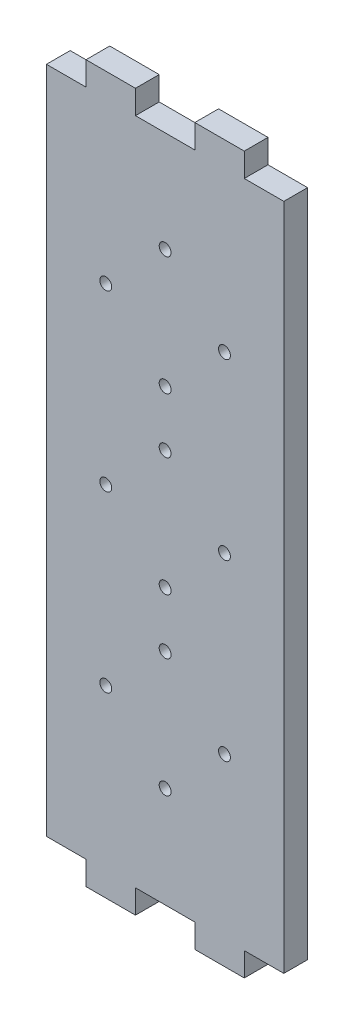
ISO-10303-21;
HEADER;
FILE_DESCRIPTION(('STEP AP214'),'2;1');
FILE_NAME('part.step','',(''),(''),'','','');
FILE_SCHEMA(('AUTOMOTIVE_DESIGN { 1 0 10303 214 1 1 1 1 }'));
ENDSEC;
DATA;
#1=APPLICATION_CONTEXT('core data for automotive mechanical design processes');
#2=APPLICATION_PROTOCOL_DEFINITION('international standard','automotive_design',2000,#1);
#3=PRODUCT_CONTEXT('',#1,'mechanical');
#4=PRODUCT('Part','Part','',(#3));
#5=PRODUCT_RELATED_PRODUCT_CATEGORY('part','',(#4));
#6=PRODUCT_DEFINITION_FORMATION('','',#4);
#7=PRODUCT_DEFINITION_CONTEXT('part definition',#1,'design');
#8=PRODUCT_DEFINITION('design','',#6,#7);
#9=PRODUCT_DEFINITION_SHAPE('','',#8);
#10=(LENGTH_UNIT() NAMED_UNIT(*) SI_UNIT(.MILLI.,.METRE.));
#11=(NAMED_UNIT(*) PLANE_ANGLE_UNIT() SI_UNIT($,.RADIAN.));
#12=(NAMED_UNIT(*) SI_UNIT($,.STERADIAN.) SOLID_ANGLE_UNIT());
#13=UNCERTAINTY_MEASURE_WITH_UNIT(LENGTH_MEASURE(1.E-05),#10,'distance_accuracy_value','');
#14=(GEOMETRIC_REPRESENTATION_CONTEXT(3) GLOBAL_UNCERTAINTY_ASSIGNED_CONTEXT((#13)) GLOBAL_UNIT_ASSIGNED_CONTEXT((#10,
#11,#12)) REPRESENTATION_CONTEXT('',''));
#15=CARTESIAN_POINT('',(0.,0.,0.));
#16=DIRECTION('',(0.,0.,1.));
#17=DIRECTION('',(1.,0.,0.));
#18=AXIS2_PLACEMENT_3D('',#15,#16,#17);
#19=CARTESIAN_POINT('',(0.,0.,3.));
#20=DIRECTION('',(0.,0.,1.));
#21=DIRECTION('',(1.,0.,0.));
#22=AXIS2_PLACEMENT_3D('',#19,#20,#21);
#23=PLANE('',#22);
#24=CARTESIAN_POINT('',(0.,-29.5,3.));
#25=DIRECTION('',(0.,0.,1.));
#26=DIRECTION('',(1.,0.,0.));
#27=AXIS2_PLACEMENT_3D('',#24,#25,#26);
#28=CIRCLE('',#27,0.75);
#29=CARTESIAN_POINT('',(0.75,-29.5,3.));
#30=VERTEX_POINT('',#29);
#31=EDGE_CURVE('E426',#30,#30,#28,.T.);
#32=ORIENTED_EDGE('',*,*,#31,.F.);
#33=EDGE_LOOP('',(#32));
#34=FACE_BOUND('',#33,.T.);
#35=CARTESIAN_POINT('',(0.,-14.5,3.));
#36=DIRECTION('',(0.,0.,1.));
#37=DIRECTION('',(1.,0.,0.));
#38=AXIS2_PLACEMENT_3D('',#35,#36,#37);
#39=CIRCLE('',#38,0.75);
#40=CARTESIAN_POINT('',(0.75,-14.5,3.));
#41=VERTEX_POINT('',#40);
#42=EDGE_CURVE('E438',#41,#41,#39,.T.);
#43=ORIENTED_EDGE('',*,*,#42,.F.);
#44=EDGE_LOOP('',(#43));
#45=FACE_BOUND('',#44,.T.);
#46=CARTESIAN_POINT('',(0.,-7.5,3.));
#47=DIRECTION('',(0.,0.,1.));
#48=DIRECTION('',(1.,0.,0.));
#49=AXIS2_PLACEMENT_3D('',#46,#47,#48);
#50=CIRCLE('',#49,0.75);
#51=CARTESIAN_POINT('',(0.75,-7.5,3.));
#52=VERTEX_POINT('',#51);
#53=EDGE_CURVE('E450',#52,#52,#50,.T.);
#54=ORIENTED_EDGE('',*,*,#53,.F.);
#55=EDGE_LOOP('',(#54));
#56=FACE_BOUND('',#55,.T.);
#57=CARTESIAN_POINT('',(0.,7.5,3.));
#58=DIRECTION('',(0.,0.,1.));
#59=DIRECTION('',(1.,0.,0.));
#60=AXIS2_PLACEMENT_3D('',#57,#58,#59);
#61=CIRCLE('',#60,0.75);
#62=CARTESIAN_POINT('',(0.75,7.5,3.));
#63=VERTEX_POINT('',#62);
#64=EDGE_CURVE('E462',#63,#63,#61,.T.);
#65=ORIENTED_EDGE('',*,*,#64,.F.);
#66=EDGE_LOOP('',(#65));
#67=FACE_BOUND('',#66,.T.);
#68=CARTESIAN_POINT('',(0.,14.5,3.));
#69=DIRECTION('',(0.,0.,1.));
#70=DIRECTION('',(1.,0.,0.));
#71=AXIS2_PLACEMENT_3D('',#68,#69,#70);
#72=CIRCLE('',#71,0.75);
#73=CARTESIAN_POINT('',(0.749999999999998,14.5,3.));
#74=VERTEX_POINT('',#73);
#75=EDGE_CURVE('E474',#74,#74,#72,.T.);
#76=ORIENTED_EDGE('',*,*,#75,.F.);
#77=EDGE_LOOP('',(#76));
#78=FACE_BOUND('',#77,.T.);
#79=CARTESIAN_POINT('',(0.,29.5,3.));
#80=DIRECTION('',(0.,0.,1.));
#81=DIRECTION('',(1.,0.,0.));
#82=AXIS2_PLACEMENT_3D('',#79,#80,#81);
#83=CIRCLE('',#82,0.75);
#84=CARTESIAN_POINT('',(0.749999999999998,29.5,3.));
#85=VERTEX_POINT('',#84);
#86=EDGE_CURVE('E205',#85,#85,#83,.T.);
#87=ORIENTED_EDGE('',*,*,#86,.F.);
#88=EDGE_LOOP('',(#87));
#89=FACE_BOUND('',#88,.T.);
#90=DIRECTION('',(0.,-1.,0.));
#91=VECTOR('',#90,1.);
#92=CARTESIAN_POINT('',(-15.,42.25,3.));
#93=LINE('',#92,#91);
#94=CARTESIAN_POINT('',(-15.,42.25,3.));
#95=VERTEX_POINT('',#94);
#96=CARTESIAN_POINT('',(-15.,-42.25,3.));
#97=VERTEX_POINT('',#96);
#98=EDGE_CURVE('E240',#95,#97,#93,.T.);
#99=ORIENTED_EDGE('',*,*,#98,.T.);
#100=DIRECTION('',(1.,0.,0.));
#101=VECTOR('',#100,1.);
#102=CARTESIAN_POINT('',(-15.,-42.25,3.));
#103=LINE('',#102,#101);
#104=CARTESIAN_POINT('',(-9.99999999999999,-42.25,3.));
#105=VERTEX_POINT('',#104);
#106=EDGE_CURVE('E128',#97,#105,#103,.T.);
#107=ORIENTED_EDGE('',*,*,#106,.T.);
#108=DIRECTION('',(0.,-1.,0.));
#109=VECTOR('',#108,1.);
#110=CARTESIAN_POINT('',(-9.99999999999999,-42.25,3.));
#111=LINE('',#110,#109);
#112=CARTESIAN_POINT('',(-9.99999999999999,-45.25,3.));
#113=VERTEX_POINT('',#112);
#114=EDGE_CURVE('E291',#105,#113,#111,.T.);
#115=ORIENTED_EDGE('',*,*,#114,.T.);
#116=DIRECTION('',(1.,0.,0.));
#117=VECTOR('',#116,1.);
#118=CARTESIAN_POINT('',(-9.99999999999999,-45.25,3.));
#119=LINE('',#118,#117);
#120=CARTESIAN_POINT('',(-3.75,-45.25,3.));
#121=VERTEX_POINT('',#120);
#122=EDGE_CURVE('E310',#113,#121,#119,.T.);
#123=ORIENTED_EDGE('',*,*,#122,.T.);
#124=DIRECTION('',(0.,1.,0.));
#125=VECTOR('',#124,1.);
#126=CARTESIAN_POINT('',(-3.75,-45.25,3.));
#127=LINE('',#126,#125);
#128=CARTESIAN_POINT('',(-3.74999999999999,-42.25,3.));
#129=VERTEX_POINT('',#128);
#130=EDGE_CURVE('E307',#121,#129,#127,.T.);
#131=ORIENTED_EDGE('',*,*,#130,.T.);
#132=DIRECTION('',(1.,0.,0.));
#133=VECTOR('',#132,1.);
#134=CARTESIAN_POINT('',(-3.74999999999999,-42.25,3.));
#135=LINE('',#134,#133);
#136=CARTESIAN_POINT('',(3.75,-42.25,3.));
#137=VERTEX_POINT('',#136);
#138=EDGE_CURVE('E309',#129,#137,#135,.T.);
#139=ORIENTED_EDGE('',*,*,#138,.T.);
#140=DIRECTION('',(0.,-1.,0.));
#141=VECTOR('',#140,1.);
#142=CARTESIAN_POINT('',(3.75,-42.25,3.));
#143=LINE('',#142,#141);
#144=CARTESIAN_POINT('',(3.75,-45.25,3.));
#145=VERTEX_POINT('',#144);
#146=EDGE_CURVE('E312',#137,#145,#143,.T.);
#147=ORIENTED_EDGE('',*,*,#146,.T.);
#148=DIRECTION('',(1.,0.,0.));
#149=VECTOR('',#148,1.);
#150=CARTESIAN_POINT('',(3.75,-45.25,3.));
#151=LINE('',#150,#149);
#152=CARTESIAN_POINT('',(9.99999999999999,-45.25,3.));
#153=VERTEX_POINT('',#152);
#154=EDGE_CURVE('E318',#145,#153,#151,.T.);
#155=ORIENTED_EDGE('',*,*,#154,.T.);
#156=DIRECTION('',(0.,1.,0.));
#157=VECTOR('',#156,1.);
#158=CARTESIAN_POINT('',(9.99999999999999,-45.25,3.));
#159=LINE('',#158,#157);
#160=CARTESIAN_POINT('',(9.99999999999999,-42.25,3.));
#161=VERTEX_POINT('',#160);
#162=EDGE_CURVE('E320',#153,#161,#159,.T.);
#163=ORIENTED_EDGE('',*,*,#162,.T.);
#164=DIRECTION('',(1.,0.,0.));
#165=VECTOR('',#164,1.);
#166=CARTESIAN_POINT('',(9.99999999999999,-42.25,3.));
#167=LINE('',#166,#165);
#168=CARTESIAN_POINT('',(15.,-42.25,3.));
#169=VERTEX_POINT('',#168);
#170=EDGE_CURVE('E322',#161,#169,#167,.T.);
#171=ORIENTED_EDGE('',*,*,#170,.T.);
#172=DIRECTION('',(0.,1.,0.));
#173=VECTOR('',#172,1.);
#174=CARTESIAN_POINT('',(15.,42.25,3.));
#175=LINE('',#174,#173);
#176=CARTESIAN_POINT('',(15.,42.25,3.));
#177=VERTEX_POINT('',#176);
#178=EDGE_CURVE('E324',#169,#177,#175,.T.);
#179=ORIENTED_EDGE('',*,*,#178,.T.);
#180=DIRECTION('',(-1.,0.,0.));
#181=VECTOR('',#180,1.);
#182=CARTESIAN_POINT('',(9.99999999999999,42.25,3.));
#183=LINE('',#182,#181);
#184=CARTESIAN_POINT('',(9.99999999999999,42.25,3.));
#185=VERTEX_POINT('',#184);
#186=EDGE_CURVE('E326',#177,#185,#183,.T.);
#187=ORIENTED_EDGE('',*,*,#186,.T.);
#188=DIRECTION('',(0.,1.,0.));
#189=VECTOR('',#188,1.);
#190=CARTESIAN_POINT('',(9.99999999999999,45.25,3.));
#191=LINE('',#190,#189);
#192=CARTESIAN_POINT('',(9.99999999999999,45.25,3.));
#193=VERTEX_POINT('',#192);
#194=EDGE_CURVE('E328',#185,#193,#191,.T.);
#195=ORIENTED_EDGE('',*,*,#194,.T.);
#196=DIRECTION('',(-1.,0.,0.));
#197=VECTOR('',#196,1.);
#198=CARTESIAN_POINT('',(3.75,45.25,3.));
#199=LINE('',#198,#197);
#200=CARTESIAN_POINT('',(3.75,45.25,3.));
#201=VERTEX_POINT('',#200);
#202=EDGE_CURVE('E330',#193,#201,#199,.T.);
#203=ORIENTED_EDGE('',*,*,#202,.T.);
#204=DIRECTION('',(0.,-1.,0.));
#205=VECTOR('',#204,1.);
#206=CARTESIAN_POINT('',(3.75,42.25,3.));
#207=LINE('',#206,#205);
#208=CARTESIAN_POINT('',(3.75,42.25,3.));
#209=VERTEX_POINT('',#208);
#210=EDGE_CURVE('E332',#201,#209,#207,.T.);
#211=ORIENTED_EDGE('',*,*,#210,.T.);
#212=DIRECTION('',(-1.,0.,0.));
#213=VECTOR('',#212,1.);
#214=CARTESIAN_POINT('',(-3.75,42.25,3.));
#215=LINE('',#214,#213);
#216=CARTESIAN_POINT('',(-3.75,42.25,3.));
#217=VERTEX_POINT('',#216);
#218=EDGE_CURVE('E334',#209,#217,#215,.T.);
#219=ORIENTED_EDGE('',*,*,#218,.T.);
#220=DIRECTION('',(0.,1.,0.));
#221=VECTOR('',#220,1.);
#222=CARTESIAN_POINT('',(-3.75,45.25,3.));
#223=LINE('',#222,#221);
#224=CARTESIAN_POINT('',(-3.75,45.25,3.));
#225=VERTEX_POINT('',#224);
#226=EDGE_CURVE('E183',#217,#225,#223,.T.);
#227=ORIENTED_EDGE('',*,*,#226,.T.);
#228=DIRECTION('',(-1.,0.,0.));
#229=VECTOR('',#228,1.);
#230=CARTESIAN_POINT('',(-10.,45.25,3.));
#231=LINE('',#230,#229);
#232=CARTESIAN_POINT('',(-10.,45.25,3.));
#233=VERTEX_POINT('',#232);
#234=EDGE_CURVE('E177',#225,#233,#231,.T.);
#235=ORIENTED_EDGE('',*,*,#234,.T.);
#236=DIRECTION('',(0.,-1.,0.));
#237=VECTOR('',#236,1.);
#238=CARTESIAN_POINT('',(-10.,42.25,3.));
#239=LINE('',#238,#237);
#240=CARTESIAN_POINT('',(-10.,42.25,3.));
#241=VERTEX_POINT('',#240);
#242=EDGE_CURVE('E181',#233,#241,#239,.T.);
#243=ORIENTED_EDGE('',*,*,#242,.T.);
#244=DIRECTION('',(-1.,0.,0.));
#245=VECTOR('',#244,1.);
#246=CARTESIAN_POINT('',(-15.,42.25,3.));
#247=LINE('',#246,#245);
#248=EDGE_CURVE('E49',#241,#95,#247,.T.);
#249=ORIENTED_EDGE('',*,*,#248,.T.);
#250=EDGE_LOOP('',(#99,#107,#115,#123,#131,#139,#147,#155,#163,#171,#179,#187,#195,#203,#211,
#219,#227,#235,#243,#249));
#251=FACE_BOUND('',#250,.T.);
#252=CARTESIAN_POINT('',(7.5,22.,3.));
#253=DIRECTION('',(0.,0.,1.));
#254=DIRECTION('',(1.,0.,0.));
#255=AXIS2_PLACEMENT_3D('',#252,#253,#254);
#256=CIRCLE('',#255,0.75);
#257=CARTESIAN_POINT('',(8.25,22.,3.));
#258=VERTEX_POINT('',#257);
#259=EDGE_CURVE('E480',#258,#258,#256,.T.);
#260=ORIENTED_EDGE('',*,*,#259,.F.);
#261=EDGE_LOOP('',(#260));
#262=FACE_BOUND('',#261,.T.);
#263=CARTESIAN_POINT('',(-7.5,22.,3.));
#264=DIRECTION('',(0.,0.,1.));
#265=DIRECTION('',(1.,0.,0.));
#266=AXIS2_PLACEMENT_3D('',#263,#264,#265);
#267=CIRCLE('',#266,0.75);
#268=CARTESIAN_POINT('',(-6.75,22.,3.));
#269=VERTEX_POINT('',#268);
#270=EDGE_CURVE('E468',#269,#269,#267,.T.);
#271=ORIENTED_EDGE('',*,*,#270,.F.);
#272=EDGE_LOOP('',(#271));
#273=FACE_BOUND('',#272,.T.);
#274=CARTESIAN_POINT('',(-7.5,0.,3.));
#275=DIRECTION('',(0.,0.,1.));
#276=DIRECTION('',(1.,0.,0.));
#277=AXIS2_PLACEMENT_3D('',#274,#275,#276);
#278=CIRCLE('',#277,0.75);
#279=CARTESIAN_POINT('',(-6.75,0.,3.));
#280=VERTEX_POINT('',#279);
#281=EDGE_CURVE('E456',#280,#280,#278,.T.);
#282=ORIENTED_EDGE('',*,*,#281,.F.);
#283=EDGE_LOOP('',(#282));
#284=FACE_BOUND('',#283,.T.);
#285=CARTESIAN_POINT('',(7.5,0.,3.));
#286=DIRECTION('',(0.,0.,1.));
#287=DIRECTION('',(1.,0.,0.));
#288=AXIS2_PLACEMENT_3D('',#285,#286,#287);
#289=CIRCLE('',#288,0.75);
#290=CARTESIAN_POINT('',(8.25,0.,3.));
#291=VERTEX_POINT('',#290);
#292=EDGE_CURVE('E444',#291,#291,#289,.T.);
#293=ORIENTED_EDGE('',*,*,#292,.F.);
#294=EDGE_LOOP('',(#293));
#295=FACE_BOUND('',#294,.T.);
#296=CARTESIAN_POINT('',(-7.5,-22.,3.));
#297=DIRECTION('',(0.,0.,1.));
#298=DIRECTION('',(1.,0.,0.));
#299=AXIS2_PLACEMENT_3D('',#296,#297,#298);
#300=CIRCLE('',#299,0.75);
#301=CARTESIAN_POINT('',(-6.75,-22.,3.));
#302=VERTEX_POINT('',#301);
#303=EDGE_CURVE('E432',#302,#302,#300,.T.);
#304=ORIENTED_EDGE('',*,*,#303,.F.);
#305=EDGE_LOOP('',(#304));
#306=FACE_BOUND('',#305,.T.);
#307=CARTESIAN_POINT('',(7.5,-22.,3.));
#308=DIRECTION('',(0.,0.,1.));
#309=DIRECTION('',(1.,0.,0.));
#310=AXIS2_PLACEMENT_3D('',#307,#308,#309);
#311=CIRCLE('',#310,0.75);
#312=CARTESIAN_POINT('',(8.25,-22.,3.));
#313=VERTEX_POINT('',#312);
#314=EDGE_CURVE('E417',#313,#313,#311,.T.);
#315=ORIENTED_EDGE('',*,*,#314,.F.);
#316=EDGE_LOOP('',(#315));
#317=FACE_BOUND('',#316,.T.);
#318=ADVANCED_FACE('F32',(#34,#45,#56,#67,#78,#89,#251,#262,#273,#284,#295,#306,#317),#23,.T.);
#319=CARTESIAN_POINT('',(0.,0.,0.));
#320=DIRECTION('',(0.,0.,1.));
#321=DIRECTION('',(1.,0.,0.));
#322=AXIS2_PLACEMENT_3D('',#319,#320,#321);
#323=PLANE('',#322);
#324=DIRECTION('',(0.,-1.,0.));
#325=VECTOR('',#324,1.);
#326=CARTESIAN_POINT('',(-15.,42.25,0.));
#327=LINE('',#326,#325);
#328=CARTESIAN_POINT('',(-15.,42.25,0.));
#329=VERTEX_POINT('',#328);
#330=CARTESIAN_POINT('',(-15.,-42.25,0.));
#331=VERTEX_POINT('',#330);
#332=EDGE_CURVE('E201',#329,#331,#327,.T.);
#333=ORIENTED_EDGE('',*,*,#332,.F.);
#334=DIRECTION('',(-1.,0.,0.));
#335=VECTOR('',#334,1.);
#336=CARTESIAN_POINT('',(-15.,42.25,0.));
#337=LINE('',#336,#335);
#338=CARTESIAN_POINT('',(-10.,42.25,0.));
#339=VERTEX_POINT('',#338);
#340=EDGE_CURVE('E120',#339,#329,#337,.T.);
#341=ORIENTED_EDGE('',*,*,#340,.F.);
#342=DIRECTION('',(0.,-1.,0.));
#343=VECTOR('',#342,1.);
#344=CARTESIAN_POINT('',(-10.,42.25,0.));
#345=LINE('',#344,#343);
#346=CARTESIAN_POINT('',(-10.,45.25,0.));
#347=VERTEX_POINT('',#346);
#348=EDGE_CURVE('E114',#347,#339,#345,.T.);
#349=ORIENTED_EDGE('',*,*,#348,.F.);
#350=DIRECTION('',(-1.,0.,0.));
#351=VECTOR('',#350,1.);
#352=CARTESIAN_POINT('',(-10.,45.25,0.));
#353=LINE('',#352,#351);
#354=CARTESIAN_POINT('',(-3.75,45.25,0.));
#355=VERTEX_POINT('',#354);
#356=EDGE_CURVE('E191',#355,#347,#353,.T.);
#357=ORIENTED_EDGE('',*,*,#356,.F.);
#358=DIRECTION('',(0.,1.,0.));
#359=VECTOR('',#358,1.);
#360=CARTESIAN_POINT('',(-3.75,45.25,0.));
#361=LINE('',#360,#359);
#362=CARTESIAN_POINT('',(-3.75,42.25,0.));
#363=VERTEX_POINT('',#362);
#364=EDGE_CURVE('E235',#363,#355,#361,.T.);
#365=ORIENTED_EDGE('',*,*,#364,.F.);
#366=DIRECTION('',(-1.,0.,0.));
#367=VECTOR('',#366,1.);
#368=CARTESIAN_POINT('',(-3.75,42.25,0.));
#369=LINE('',#368,#367);
#370=CARTESIAN_POINT('',(3.75,42.25,0.));
#371=VERTEX_POINT('',#370);
#372=EDGE_CURVE('E233',#371,#363,#369,.T.);
#373=ORIENTED_EDGE('',*,*,#372,.F.);
#374=DIRECTION('',(0.,-1.,0.));
#375=VECTOR('',#374,1.);
#376=CARTESIAN_POINT('',(3.75,42.25,0.));
#377=LINE('',#376,#375);
#378=CARTESIAN_POINT('',(3.75,45.25,0.));
#379=VERTEX_POINT('',#378);
#380=EDGE_CURVE('E231',#379,#371,#377,.T.);
#381=ORIENTED_EDGE('',*,*,#380,.F.);
#382=DIRECTION('',(-1.,0.,0.));
#383=VECTOR('',#382,1.);
#384=CARTESIAN_POINT('',(3.75,45.25,0.));
#385=LINE('',#384,#383);
#386=CARTESIAN_POINT('',(9.99999999999999,45.25,0.));
#387=VERTEX_POINT('',#386);
#388=EDGE_CURVE('E229',#387,#379,#385,.T.);
#389=ORIENTED_EDGE('',*,*,#388,.F.);
#390=DIRECTION('',(0.,1.,0.));
#391=VECTOR('',#390,1.);
#392=CARTESIAN_POINT('',(9.99999999999999,45.25,0.));
#393=LINE('',#392,#391);
#394=CARTESIAN_POINT('',(9.99999999999999,42.25,0.));
#395=VERTEX_POINT('',#394);
#396=EDGE_CURVE('E227',#395,#387,#393,.T.);
#397=ORIENTED_EDGE('',*,*,#396,.F.);
#398=DIRECTION('',(-1.,0.,0.));
#399=VECTOR('',#398,1.);
#400=CARTESIAN_POINT('',(9.99999999999999,42.25,0.));
#401=LINE('',#400,#399);
#402=CARTESIAN_POINT('',(15.,42.25,0.));
#403=VERTEX_POINT('',#402);
#404=EDGE_CURVE('E225',#403,#395,#401,.T.);
#405=ORIENTED_EDGE('',*,*,#404,.F.);
#406=DIRECTION('',(0.,1.,0.));
#407=VECTOR('',#406,1.);
#408=CARTESIAN_POINT('',(15.,42.25,0.));
#409=LINE('',#408,#407);
#410=CARTESIAN_POINT('',(15.,-42.25,0.));
#411=VERTEX_POINT('',#410);
#412=EDGE_CURVE('E223',#411,#403,#409,.T.);
#413=ORIENTED_EDGE('',*,*,#412,.F.);
#414=DIRECTION('',(1.,0.,0.));
#415=VECTOR('',#414,1.);
#416=CARTESIAN_POINT('',(9.99999999999999,-42.25,0.));
#417=LINE('',#416,#415);
#418=CARTESIAN_POINT('',(9.99999999999999,-42.25,0.));
#419=VERTEX_POINT('',#418);
#420=EDGE_CURVE('E221',#419,#411,#417,.T.);
#421=ORIENTED_EDGE('',*,*,#420,.F.);
#422=DIRECTION('',(0.,1.,0.));
#423=VECTOR('',#422,1.);
#424=CARTESIAN_POINT('',(9.99999999999999,-45.25,0.));
#425=LINE('',#424,#423);
#426=CARTESIAN_POINT('',(9.99999999999999,-45.25,0.));
#427=VERTEX_POINT('',#426);
#428=EDGE_CURVE('E219',#427,#419,#425,.T.);
#429=ORIENTED_EDGE('',*,*,#428,.F.);
#430=DIRECTION('',(1.,0.,0.));
#431=VECTOR('',#430,1.);
#432=CARTESIAN_POINT('',(3.75,-45.25,0.));
#433=LINE('',#432,#431);
#434=CARTESIAN_POINT('',(3.75,-45.25,0.));
#435=VERTEX_POINT('',#434);
#436=EDGE_CURVE('E217',#435,#427,#433,.T.);
#437=ORIENTED_EDGE('',*,*,#436,.F.);
#438=DIRECTION('',(0.,-1.,0.));
#439=VECTOR('',#438,1.);
#440=CARTESIAN_POINT('',(3.75,-42.25,0.));
#441=LINE('',#440,#439);
#442=CARTESIAN_POINT('',(3.75,-42.25,0.));
#443=VERTEX_POINT('',#442);
#444=EDGE_CURVE('E215',#443,#435,#441,.T.);
#445=ORIENTED_EDGE('',*,*,#444,.F.);
#446=DIRECTION('',(1.,0.,0.));
#447=VECTOR('',#446,1.);
#448=CARTESIAN_POINT('',(-3.74999999999999,-42.25,0.));
#449=LINE('',#448,#447);
#450=CARTESIAN_POINT('',(-3.74999999999999,-42.25,0.));
#451=VERTEX_POINT('',#450);
#452=EDGE_CURVE('E213',#451,#443,#449,.T.);
#453=ORIENTED_EDGE('',*,*,#452,.F.);
#454=DIRECTION('',(0.,1.,0.));
#455=VECTOR('',#454,1.);
#456=CARTESIAN_POINT('',(-3.75,-45.25,0.));
#457=LINE('',#456,#455);
#458=CARTESIAN_POINT('',(-3.75,-45.25,0.));
#459=VERTEX_POINT('',#458);
#460=EDGE_CURVE('E211',#459,#451,#457,.T.);
#461=ORIENTED_EDGE('',*,*,#460,.F.);
#462=DIRECTION('',(1.,0.,0.));
#463=VECTOR('',#462,1.);
#464=CARTESIAN_POINT('',(-9.99999999999999,-45.25,0.));
#465=LINE('',#464,#463);
#466=CARTESIAN_POINT('',(-9.99999999999999,-45.25,0.));
#467=VERTEX_POINT('',#466);
#468=EDGE_CURVE('E209',#467,#459,#465,.T.);
#469=ORIENTED_EDGE('',*,*,#468,.F.);
#470=DIRECTION('',(0.,-1.,0.));
#471=VECTOR('',#470,1.);
#472=CARTESIAN_POINT('',(-9.99999999999999,-42.25,0.));
#473=LINE('',#472,#471);
#474=CARTESIAN_POINT('',(-9.99999999999999,-42.25,0.));
#475=VERTEX_POINT('',#474);
#476=EDGE_CURVE('E207',#475,#467,#473,.T.);
#477=ORIENTED_EDGE('',*,*,#476,.F.);
#478=DIRECTION('',(1.,0.,0.));
#479=VECTOR('',#478,1.);
#480=CARTESIAN_POINT('',(-15.,-42.25,0.));
#481=LINE('',#480,#479);
#482=EDGE_CURVE('E204',#331,#475,#481,.T.);
#483=ORIENTED_EDGE('',*,*,#482,.F.);
#484=EDGE_LOOP('',(#333,#341,#349,#357,#365,#373,#381,#389,#397,#405,#413,#421,#429,#437,#445,
#453,#461,#469,#477,#483));
#485=FACE_BOUND('',#484,.T.);
#486=CARTESIAN_POINT('',(0.,29.5,0.));
#487=DIRECTION('',(0.,0.,1.));
#488=DIRECTION('',(1.,0.,0.));
#489=AXIS2_PLACEMENT_3D('',#486,#487,#488);
#490=CIRCLE('',#489,0.75);
#491=CARTESIAN_POINT('',(0.749999999999998,29.5,0.));
#492=VERTEX_POINT('',#491);
#493=EDGE_CURVE('E483',#492,#492,#490,.T.);
#494=ORIENTED_EDGE('',*,*,#493,.T.);
#495=EDGE_LOOP('',(#494));
#496=FACE_BOUND('',#495,.T.);
#497=CARTESIAN_POINT('',(7.5,22.,0.));
#498=DIRECTION('',(0.,0.,1.));
#499=DIRECTION('',(1.,0.,0.));
#500=AXIS2_PLACEMENT_3D('',#497,#498,#499);
#501=CIRCLE('',#500,0.75);
#502=CARTESIAN_POINT('',(8.25,22.,0.));
#503=VERTEX_POINT('',#502);
#504=EDGE_CURVE('E477',#503,#503,#501,.T.);
#505=ORIENTED_EDGE('',*,*,#504,.T.);
#506=EDGE_LOOP('',(#505));
#507=FACE_BOUND('',#506,.T.);
#508=CARTESIAN_POINT('',(0.,14.5,0.));
#509=DIRECTION('',(0.,0.,1.));
#510=DIRECTION('',(1.,0.,0.));
#511=AXIS2_PLACEMENT_3D('',#508,#509,#510);
#512=CIRCLE('',#511,0.75);
#513=CARTESIAN_POINT('',(0.749999999999998,14.5,0.));
#514=VERTEX_POINT('',#513);
#515=EDGE_CURVE('E471',#514,#514,#512,.T.);
#516=ORIENTED_EDGE('',*,*,#515,.T.);
#517=EDGE_LOOP('',(#516));
#518=FACE_BOUND('',#517,.T.);
#519=CARTESIAN_POINT('',(-7.5,22.,0.));
#520=DIRECTION('',(0.,0.,1.));
#521=DIRECTION('',(1.,0.,0.));
#522=AXIS2_PLACEMENT_3D('',#519,#520,#521);
#523=CIRCLE('',#522,0.75);
#524=CARTESIAN_POINT('',(-6.75,22.,0.));
#525=VERTEX_POINT('',#524);
#526=EDGE_CURVE('E465',#525,#525,#523,.T.);
#527=ORIENTED_EDGE('',*,*,#526,.T.);
#528=EDGE_LOOP('',(#527));
#529=FACE_BOUND('',#528,.T.);
#530=CARTESIAN_POINT('',(0.,7.5,0.));
#531=DIRECTION('',(0.,0.,1.));
#532=DIRECTION('',(1.,0.,0.));
#533=AXIS2_PLACEMENT_3D('',#530,#531,#532);
#534=CIRCLE('',#533,0.75);
#535=CARTESIAN_POINT('',(0.75,7.5,0.));
#536=VERTEX_POINT('',#535);
#537=EDGE_CURVE('E459',#536,#536,#534,.T.);
#538=ORIENTED_EDGE('',*,*,#537,.T.);
#539=EDGE_LOOP('',(#538));
#540=FACE_BOUND('',#539,.T.);
#541=CARTESIAN_POINT('',(-7.5,0.,0.));
#542=DIRECTION('',(0.,0.,1.));
#543=DIRECTION('',(1.,0.,0.));
#544=AXIS2_PLACEMENT_3D('',#541,#542,#543);
#545=CIRCLE('',#544,0.75);
#546=CARTESIAN_POINT('',(-6.75,0.,0.));
#547=VERTEX_POINT('',#546);
#548=EDGE_CURVE('E453',#547,#547,#545,.T.);
#549=ORIENTED_EDGE('',*,*,#548,.T.);
#550=EDGE_LOOP('',(#549));
#551=FACE_BOUND('',#550,.T.);
#552=CARTESIAN_POINT('',(0.,-7.5,0.));
#553=DIRECTION('',(0.,0.,1.));
#554=DIRECTION('',(1.,0.,0.));
#555=AXIS2_PLACEMENT_3D('',#552,#553,#554);
#556=CIRCLE('',#555,0.75);
#557=CARTESIAN_POINT('',(0.75,-7.5,0.));
#558=VERTEX_POINT('',#557);
#559=EDGE_CURVE('E447',#558,#558,#556,.T.);
#560=ORIENTED_EDGE('',*,*,#559,.T.);
#561=EDGE_LOOP('',(#560));
#562=FACE_BOUND('',#561,.T.);
#563=CARTESIAN_POINT('',(7.5,0.,0.));
#564=DIRECTION('',(0.,0.,1.));
#565=DIRECTION('',(1.,0.,0.));
#566=AXIS2_PLACEMENT_3D('',#563,#564,#565);
#567=CIRCLE('',#566,0.75);
#568=CARTESIAN_POINT('',(8.25,0.,0.));
#569=VERTEX_POINT('',#568);
#570=EDGE_CURVE('E441',#569,#569,#567,.T.);
#571=ORIENTED_EDGE('',*,*,#570,.T.);
#572=EDGE_LOOP('',(#571));
#573=FACE_BOUND('',#572,.T.);
#574=CARTESIAN_POINT('',(0.,-14.5,0.));
#575=DIRECTION('',(0.,0.,1.));
#576=DIRECTION('',(1.,0.,0.));
#577=AXIS2_PLACEMENT_3D('',#574,#575,#576);
#578=CIRCLE('',#577,0.75);
#579=CARTESIAN_POINT('',(0.75,-14.5,0.));
#580=VERTEX_POINT('',#579);
#581=EDGE_CURVE('E435',#580,#580,#578,.T.);
#582=ORIENTED_EDGE('',*,*,#581,.T.);
#583=EDGE_LOOP('',(#582));
#584=FACE_BOUND('',#583,.T.);
#585=CARTESIAN_POINT('',(-7.5,-22.,0.));
#586=DIRECTION('',(0.,0.,1.));
#587=DIRECTION('',(1.,0.,0.));
#588=AXIS2_PLACEMENT_3D('',#585,#586,#587);
#589=CIRCLE('',#588,0.75);
#590=CARTESIAN_POINT('',(-6.75,-22.,0.));
#591=VERTEX_POINT('',#590);
#592=EDGE_CURVE('E429',#591,#591,#589,.T.);
#593=ORIENTED_EDGE('',*,*,#592,.T.);
#594=EDGE_LOOP('',(#593));
#595=FACE_BOUND('',#594,.T.);
#596=CARTESIAN_POINT('',(0.,-29.5,0.));
#597=DIRECTION('',(0.,0.,1.));
#598=DIRECTION('',(1.,0.,0.));
#599=AXIS2_PLACEMENT_3D('',#596,#597,#598);
#600=CIRCLE('',#599,0.75);
#601=CARTESIAN_POINT('',(0.75,-29.5,0.));
#602=VERTEX_POINT('',#601);
#603=EDGE_CURVE('E423',#602,#602,#600,.T.);
#604=ORIENTED_EDGE('',*,*,#603,.T.);
#605=EDGE_LOOP('',(#604));
#606=FACE_BOUND('',#605,.T.);
#607=CARTESIAN_POINT('',(7.5,-22.,0.));
#608=DIRECTION('',(0.,0.,1.));
#609=DIRECTION('',(1.,0.,0.));
#610=AXIS2_PLACEMENT_3D('',#607,#608,#609);
#611=CIRCLE('',#610,0.75);
#612=CARTESIAN_POINT('',(8.25,-22.,0.));
#613=VERTEX_POINT('',#612);
#614=EDGE_CURVE('E420',#613,#613,#611,.T.);
#615=ORIENTED_EDGE('',*,*,#614,.T.);
#616=EDGE_LOOP('',(#615));
#617=FACE_BOUND('',#616,.T.);
#618=ADVANCED_FACE('F295',(#485,#496,#507,#518,#529,#540,#551,#562,#573,#584,#595,#606,#617),
#323,.F.);
#619=CARTESIAN_POINT('',(-15.,42.25,3.));
#620=DIRECTION('',(1.,0.,0.));
#621=DIRECTION('',(0.,1.,0.));
#622=AXIS2_PLACEMENT_3D('',#619,#620,#621);
#623=PLANE('',#622);
#624=ORIENTED_EDGE('',*,*,#332,.T.);
#625=DIRECTION('',(0.,0.,-1.));
#626=VECTOR('',#625,1.);
#627=CARTESIAN_POINT('',(-15.,-42.25,3.));
#628=LINE('',#627,#626);
#629=EDGE_CURVE('E11',#97,#331,#628,.T.);
#630=ORIENTED_EDGE('',*,*,#629,.F.);
#631=ORIENTED_EDGE('',*,*,#98,.F.);
#632=DIRECTION('',(0.,0.,-1.));
#633=VECTOR('',#632,1.);
#634=CARTESIAN_POINT('',(-15.,42.25,3.));
#635=LINE('',#634,#633);
#636=EDGE_CURVE('E197',#95,#329,#635,.T.);
#637=ORIENTED_EDGE('',*,*,#636,.T.);
#638=EDGE_LOOP('',(#624,#630,#631,#637));
#639=FACE_BOUND('',#638,.T.);
#640=ADVANCED_FACE('F34',(#639),#623,.F.);
#641=CARTESIAN_POINT('',(-15.,-42.25,3.));
#642=DIRECTION('',(0.,1.,0.));
#643=DIRECTION('',(0.,0.,1.));
#644=AXIS2_PLACEMENT_3D('',#641,#642,#643);
#645=PLANE('',#644);
#646=ORIENTED_EDGE('',*,*,#482,.T.);
#647=DIRECTION('',(0.,0.,-1.));
#648=VECTOR('',#647,1.);
#649=CARTESIAN_POINT('',(-9.99999999999999,-42.25,3.));
#650=LINE('',#649,#648);
#651=EDGE_CURVE('E41',#105,#475,#650,.T.);
#652=ORIENTED_EDGE('',*,*,#651,.F.);
#653=ORIENTED_EDGE('',*,*,#106,.F.);
#654=ORIENTED_EDGE('',*,*,#629,.T.);
#655=EDGE_LOOP('',(#646,#652,#653,#654));
#656=FACE_BOUND('',#655,.T.);
#657=ADVANCED_FACE('F745',(#656),#645,.F.);
#658=CARTESIAN_POINT('',(-9.99999999999999,-42.25,3.));
#659=DIRECTION('',(1.,0.,0.));
#660=DIRECTION('',(0.,0.,-1.));
#661=AXIS2_PLACEMENT_3D('',#658,#659,#660);
#662=PLANE('',#661);
#663=ORIENTED_EDGE('',*,*,#476,.T.);
#664=DIRECTION('',(0.,0.,-1.));
#665=VECTOR('',#664,1.);
#666=CARTESIAN_POINT('',(-9.99999999999999,-45.25,3.));
#667=LINE('',#666,#665);
#668=EDGE_CURVE('E283',#113,#467,#667,.T.);
#669=ORIENTED_EDGE('',*,*,#668,.F.);
#670=ORIENTED_EDGE('',*,*,#114,.F.);
#671=ORIENTED_EDGE('',*,*,#651,.T.);
#672=EDGE_LOOP('',(#663,#669,#670,#671));
#673=FACE_BOUND('',#672,.T.);
#674=ADVANCED_FACE('F289',(#673),#662,.F.);
#675=CARTESIAN_POINT('',(-9.99999999999999,-45.25,3.));
#676=DIRECTION('',(0.,1.,0.));
#677=DIRECTION('',(0.,0.,1.));
#678=AXIS2_PLACEMENT_3D('',#675,#676,#677);
#679=PLANE('',#678);
#680=ORIENTED_EDGE('',*,*,#468,.T.);
#681=DIRECTION('',(0.,0.,-1.));
#682=VECTOR('',#681,1.);
#683=CARTESIAN_POINT('',(-3.75,-45.25,3.));
#684=LINE('',#683,#682);
#685=EDGE_CURVE('E280',#121,#459,#684,.T.);
#686=ORIENTED_EDGE('',*,*,#685,.F.);
#687=ORIENTED_EDGE('',*,*,#122,.F.);
#688=ORIENTED_EDGE('',*,*,#668,.T.);
#689=EDGE_LOOP('',(#680,#686,#687,#688));
#690=FACE_BOUND('',#689,.T.);
#691=ADVANCED_FACE('F301',(#690),#679,.F.);
#692=CARTESIAN_POINT('',(-3.75,-45.25,3.));
#693=DIRECTION('',(-1.,0.,0.));
#694=DIRECTION('',(0.,-1.,0.));
#695=AXIS2_PLACEMENT_3D('',#692,#693,#694);
#696=PLANE('',#695);
#697=ORIENTED_EDGE('',*,*,#460,.T.);
#698=DIRECTION('',(0.,0.,-1.));
#699=VECTOR('',#698,1.);
#700=CARTESIAN_POINT('',(-3.74999999999999,-42.25,3.));
#701=LINE('',#700,#699);
#702=EDGE_CURVE('E277',#129,#451,#701,.T.);
#703=ORIENTED_EDGE('',*,*,#702,.F.);
#704=ORIENTED_EDGE('',*,*,#130,.F.);
#705=ORIENTED_EDGE('',*,*,#685,.T.);
#706=EDGE_LOOP('',(#697,#703,#704,#705));
#707=FACE_BOUND('',#706,.T.);
#708=ADVANCED_FACE('F305',(#707),#696,.F.);
#709=CARTESIAN_POINT('',(-3.74999999999999,-42.25,3.));
#710=DIRECTION('',(0.,1.,0.));
#711=DIRECTION('',(0.,0.,1.));
#712=AXIS2_PLACEMENT_3D('',#709,#710,#711);
#713=PLANE('',#712);
#714=ORIENTED_EDGE('',*,*,#452,.T.);
#715=DIRECTION('',(0.,0.,-1.));
#716=VECTOR('',#715,1.);
#717=CARTESIAN_POINT('',(3.75,-42.25,3.));
#718=LINE('',#717,#716);
#719=EDGE_CURVE('E274',#137,#443,#718,.T.);
#720=ORIENTED_EDGE('',*,*,#719,.F.);
#721=ORIENTED_EDGE('',*,*,#138,.F.);
#722=ORIENTED_EDGE('',*,*,#702,.T.);
#723=EDGE_LOOP('',(#714,#720,#721,#722));
#724=FACE_BOUND('',#723,.T.);
#725=ADVANCED_FACE('F710',(#724),#713,.F.);
#726=CARTESIAN_POINT('',(3.75,-42.25,3.));
#727=DIRECTION('',(1.,0.,0.));
#728=DIRECTION('',(0.,1.,0.));
#729=AXIS2_PLACEMENT_3D('',#726,#727,#728);
#730=PLANE('',#729);
#731=ORIENTED_EDGE('',*,*,#444,.T.);
#732=DIRECTION('',(0.,0.,-1.));
#733=VECTOR('',#732,1.);
#734=CARTESIAN_POINT('',(3.75,-45.25,3.));
#735=LINE('',#734,#733);
#736=EDGE_CURVE('E271',#145,#435,#735,.T.);
#737=ORIENTED_EDGE('',*,*,#736,.F.);
#738=ORIENTED_EDGE('',*,*,#146,.F.);
#739=ORIENTED_EDGE('',*,*,#719,.T.);
#740=EDGE_LOOP('',(#731,#737,#738,#739));
#741=FACE_BOUND('',#740,.T.);
#742=ADVANCED_FACE('F700',(#741),#730,.F.);
#743=CARTESIAN_POINT('',(3.75,-45.25,3.));
#744=DIRECTION('',(0.,1.,0.));
#745=DIRECTION('',(0.,0.,1.));
#746=AXIS2_PLACEMENT_3D('',#743,#744,#745);
#747=PLANE('',#746);
#748=ORIENTED_EDGE('',*,*,#436,.T.);
#749=DIRECTION('',(0.,0.,-1.));
#750=VECTOR('',#749,1.);
#751=CARTESIAN_POINT('',(9.99999999999999,-45.25,3.));
#752=LINE('',#751,#750);
#753=EDGE_CURVE('E268',#153,#427,#752,.T.);
#754=ORIENTED_EDGE('',*,*,#753,.F.);
#755=ORIENTED_EDGE('',*,*,#154,.F.);
#756=ORIENTED_EDGE('',*,*,#736,.T.);
#757=EDGE_LOOP('',(#748,#754,#755,#756));
#758=FACE_BOUND('',#757,.T.);
#759=ADVANCED_FACE('F690',(#758),#747,.F.);
#760=CARTESIAN_POINT('',(9.99999999999999,-45.25,3.));
#761=DIRECTION('',(-1.,0.,0.));
#762=DIRECTION('',(0.,0.,1.));
#763=AXIS2_PLACEMENT_3D('',#760,#761,#762);
#764=PLANE('',#763);
#765=ORIENTED_EDGE('',*,*,#428,.T.);
#766=DIRECTION('',(0.,0.,-1.));
#767=VECTOR('',#766,1.);
#768=CARTESIAN_POINT('',(9.99999999999999,-42.25,3.));
#769=LINE('',#768,#767);
#770=EDGE_CURVE('E265',#161,#419,#769,.T.);
#771=ORIENTED_EDGE('',*,*,#770,.F.);
#772=ORIENTED_EDGE('',*,*,#162,.F.);
#773=ORIENTED_EDGE('',*,*,#753,.T.);
#774=EDGE_LOOP('',(#765,#771,#772,#773));
#775=FACE_BOUND('',#774,.T.);
#776=ADVANCED_FACE('F680',(#775),#764,.F.);
#777=CARTESIAN_POINT('',(9.99999999999999,-42.25,3.));
#778=DIRECTION('',(0.,1.,0.));
#779=DIRECTION('',(0.,0.,1.));
#780=AXIS2_PLACEMENT_3D('',#777,#778,#779);
#781=PLANE('',#780);
#782=ORIENTED_EDGE('',*,*,#420,.T.);
#783=DIRECTION('',(0.,0.,-1.));
#784=VECTOR('',#783,1.);
#785=CARTESIAN_POINT('',(15.,-42.25,3.));
#786=LINE('',#785,#784);
#787=EDGE_CURVE('E262',#169,#411,#786,.T.);
#788=ORIENTED_EDGE('',*,*,#787,.F.);
#789=ORIENTED_EDGE('',*,*,#170,.F.);
#790=ORIENTED_EDGE('',*,*,#770,.T.);
#791=EDGE_LOOP('',(#782,#788,#789,#790));
#792=FACE_BOUND('',#791,.T.);
#793=ADVANCED_FACE('F670',(#792),#781,.F.);
#794=CARTESIAN_POINT('',(15.,42.25,3.));
#795=DIRECTION('',(-1.,0.,0.));
#796=DIRECTION('',(0.,-1.,0.));
#797=AXIS2_PLACEMENT_3D('',#794,#795,#796);
#798=PLANE('',#797);
#799=ORIENTED_EDGE('',*,*,#412,.T.);
#800=DIRECTION('',(0.,0.,-1.));
#801=VECTOR('',#800,1.);
#802=CARTESIAN_POINT('',(15.,42.25,3.));
#803=LINE('',#802,#801);
#804=EDGE_CURVE('E259',#177,#403,#803,.T.);
#805=ORIENTED_EDGE('',*,*,#804,.F.);
#806=ORIENTED_EDGE('',*,*,#178,.F.);
#807=ORIENTED_EDGE('',*,*,#787,.T.);
#808=EDGE_LOOP('',(#799,#805,#806,#807));
#809=FACE_BOUND('',#808,.T.);
#810=ADVANCED_FACE('F660',(#809),#798,.F.);
#811=CARTESIAN_POINT('',(9.99999999999999,42.25,3.));
#812=DIRECTION('',(0.,-1.,0.));
#813=DIRECTION('',(0.,0.,-1.));
#814=AXIS2_PLACEMENT_3D('',#811,#812,#813);
#815=PLANE('',#814);
#816=ORIENTED_EDGE('',*,*,#404,.T.);
#817=DIRECTION('',(0.,0.,-1.));
#818=VECTOR('',#817,1.);
#819=CARTESIAN_POINT('',(9.99999999999999,42.25,3.));
#820=LINE('',#819,#818);
#821=EDGE_CURVE('E256',#185,#395,#820,.T.);
#822=ORIENTED_EDGE('',*,*,#821,.F.);
#823=ORIENTED_EDGE('',*,*,#186,.F.);
#824=ORIENTED_EDGE('',*,*,#804,.T.);
#825=EDGE_LOOP('',(#816,#822,#823,#824));
#826=FACE_BOUND('',#825,.T.);
#827=ADVANCED_FACE('F650',(#826),#815,.F.);
#828=CARTESIAN_POINT('',(9.99999999999999,45.25,3.));
#829=DIRECTION('',(-1.,0.,0.));
#830=DIRECTION('',(0.,0.,1.));
#831=AXIS2_PLACEMENT_3D('',#828,#829,#830);
#832=PLANE('',#831);
#833=ORIENTED_EDGE('',*,*,#396,.T.);
#834=DIRECTION('',(0.,0.,-1.));
#835=VECTOR('',#834,1.);
#836=CARTESIAN_POINT('',(9.99999999999999,45.25,3.));
#837=LINE('',#836,#835);
#838=EDGE_CURVE('E253',#193,#387,#837,.T.);
#839=ORIENTED_EDGE('',*,*,#838,.F.);
#840=ORIENTED_EDGE('',*,*,#194,.F.);
#841=ORIENTED_EDGE('',*,*,#821,.T.);
#842=EDGE_LOOP('',(#833,#839,#840,#841));
#843=FACE_BOUND('',#842,.T.);
#844=ADVANCED_FACE('F640',(#843),#832,.F.);
#845=CARTESIAN_POINT('',(3.75,45.25,3.));
#846=DIRECTION('',(0.,-1.,0.));
#847=DIRECTION('',(0.,0.,-1.));
#848=AXIS2_PLACEMENT_3D('',#845,#846,#847);
#849=PLANE('',#848);
#850=ORIENTED_EDGE('',*,*,#388,.T.);
#851=DIRECTION('',(0.,0.,-1.));
#852=VECTOR('',#851,1.);
#853=CARTESIAN_POINT('',(3.75,45.25,3.));
#854=LINE('',#853,#852);
#855=EDGE_CURVE('E250',#201,#379,#854,.T.);
#856=ORIENTED_EDGE('',*,*,#855,.F.);
#857=ORIENTED_EDGE('',*,*,#202,.F.);
#858=ORIENTED_EDGE('',*,*,#838,.T.);
#859=EDGE_LOOP('',(#850,#856,#857,#858));
#860=FACE_BOUND('',#859,.T.);
#861=ADVANCED_FACE('F630',(#860),#849,.F.);
#862=CARTESIAN_POINT('',(3.75,42.25,3.));
#863=DIRECTION('',(1.,0.,0.));
#864=DIRECTION('',(0.,1.,0.));
#865=AXIS2_PLACEMENT_3D('',#862,#863,#864);
#866=PLANE('',#865);
#867=ORIENTED_EDGE('',*,*,#380,.T.);
#868=DIRECTION('',(0.,0.,-1.));
#869=VECTOR('',#868,1.);
#870=CARTESIAN_POINT('',(3.75,42.25,3.));
#871=LINE('',#870,#869);
#872=EDGE_CURVE('E247',#209,#371,#871,.T.);
#873=ORIENTED_EDGE('',*,*,#872,.F.);
#874=ORIENTED_EDGE('',*,*,#210,.F.);
#875=ORIENTED_EDGE('',*,*,#855,.T.);
#876=EDGE_LOOP('',(#867,#873,#874,#875));
#877=FACE_BOUND('',#876,.T.);
#878=ADVANCED_FACE('F621',(#877),#866,.F.);
#879=CARTESIAN_POINT('',(-3.75,42.25,3.));
#880=DIRECTION('',(0.,-1.,0.));
#881=DIRECTION('',(0.,0.,-1.));
#882=AXIS2_PLACEMENT_3D('',#879,#880,#881);
#883=PLANE('',#882);
#884=ORIENTED_EDGE('',*,*,#372,.T.);
#885=DIRECTION('',(0.,0.,-1.));
#886=VECTOR('',#885,1.);
#887=CARTESIAN_POINT('',(-3.75,42.25,3.));
#888=LINE('',#887,#886);
#889=EDGE_CURVE('E244',#217,#363,#888,.T.);
#890=ORIENTED_EDGE('',*,*,#889,.F.);
#891=ORIENTED_EDGE('',*,*,#218,.F.);
#892=ORIENTED_EDGE('',*,*,#872,.T.);
#893=EDGE_LOOP('',(#884,#890,#891,#892));
#894=FACE_BOUND('',#893,.T.);
#895=ADVANCED_FACE('F340',(#894),#883,.F.);
#896=CARTESIAN_POINT('',(-3.75,45.25,3.));
#897=DIRECTION('',(-1.,0.,0.));
#898=DIRECTION('',(0.,-1.,0.));
#899=AXIS2_PLACEMENT_3D('',#896,#897,#898);
#900=PLANE('',#899);
#901=ORIENTED_EDGE('',*,*,#364,.T.);
#902=DIRECTION('',(0.,0.,-1.));
#903=VECTOR('',#902,1.);
#904=CARTESIAN_POINT('',(-3.75,45.25,3.));
#905=LINE('',#904,#903);
#906=EDGE_CURVE('E192',#225,#355,#905,.T.);
#907=ORIENTED_EDGE('',*,*,#906,.F.);
#908=ORIENTED_EDGE('',*,*,#226,.F.);
#909=ORIENTED_EDGE('',*,*,#889,.T.);
#910=EDGE_LOOP('',(#901,#907,#908,#909));
#911=FACE_BOUND('',#910,.T.);
#912=ADVANCED_FACE('F344',(#911),#900,.F.);
#913=CARTESIAN_POINT('',(-10.,45.25,3.));
#914=DIRECTION('',(0.,-1.,0.));
#915=DIRECTION('',(0.,0.,-1.));
#916=AXIS2_PLACEMENT_3D('',#913,#914,#915);
#917=PLANE('',#916);
#918=ORIENTED_EDGE('',*,*,#356,.T.);
#919=DIRECTION('',(0.,0.,-1.));
#920=VECTOR('',#919,1.);
#921=CARTESIAN_POINT('',(-10.,45.25,3.));
#922=LINE('',#921,#920);
#923=EDGE_CURVE('E188',#233,#347,#922,.T.);
#924=ORIENTED_EDGE('',*,*,#923,.F.);
#925=ORIENTED_EDGE('',*,*,#234,.F.);
#926=ORIENTED_EDGE('',*,*,#906,.T.);
#927=EDGE_LOOP('',(#918,#924,#925,#926));
#928=FACE_BOUND('',#927,.T.);
#929=ADVANCED_FACE('F189',(#928),#917,.F.);
#930=CARTESIAN_POINT('',(-10.,42.25,3.));
#931=DIRECTION('',(1.,0.,0.));
#932=DIRECTION('',(0.,0.,-1.));
#933=AXIS2_PLACEMENT_3D('',#930,#931,#932);
#934=PLANE('',#933);
#935=ORIENTED_EDGE('',*,*,#348,.T.);
#936=DIRECTION('',(0.,0.,-1.));
#937=VECTOR('',#936,1.);
#938=CARTESIAN_POINT('',(-10.,42.25,3.));
#939=LINE('',#938,#937);
#940=EDGE_CURVE('E193',#241,#339,#939,.T.);
#941=ORIENTED_EDGE('',*,*,#940,.F.);
#942=ORIENTED_EDGE('',*,*,#242,.F.);
#943=ORIENTED_EDGE('',*,*,#923,.T.);
#944=EDGE_LOOP('',(#935,#941,#942,#943));
#945=FACE_BOUND('',#944,.T.);
#946=ADVANCED_FACE('F195',(#945),#934,.F.);
#947=CARTESIAN_POINT('',(-15.,42.25,3.));
#948=DIRECTION('',(0.,-1.,0.));
#949=DIRECTION('',(0.,0.,-1.));
#950=AXIS2_PLACEMENT_3D('',#947,#948,#949);
#951=PLANE('',#950);
#952=ORIENTED_EDGE('',*,*,#340,.T.);
#953=ORIENTED_EDGE('',*,*,#636,.F.);
#954=ORIENTED_EDGE('',*,*,#248,.F.);
#955=ORIENTED_EDGE('',*,*,#940,.T.);
#956=EDGE_LOOP('',(#952,#953,#954,#955));
#957=FACE_BOUND('',#956,.T.);
#958=ADVANCED_FACE('F348',(#957),#951,.F.);
#959=CARTESIAN_POINT('',(0.,29.5,3.));
#960=DIRECTION('',(0.,0.,-1.));
#961=DIRECTION('',(-1.,0.,0.));
#962=AXIS2_PLACEMENT_3D('',#959,#960,#961);
#963=CYLINDRICAL_SURFACE('',#962,0.75);
#964=ORIENTED_EDGE('',*,*,#86,.T.);
#965=EDGE_LOOP('',(#964));
#966=FACE_BOUND('',#965,.T.);
#967=ORIENTED_EDGE('',*,*,#493,.F.);
#968=EDGE_LOOP('',(#967));
#969=FACE_BOUND('',#968,.T.);
#970=ADVANCED_FACE('F350',(#966,#969),#963,.F.);
#971=CARTESIAN_POINT('',(7.5,22.,3.));
#972=DIRECTION('',(0.,0.,-1.));
#973=DIRECTION('',(-1.,0.,0.));
#974=AXIS2_PLACEMENT_3D('',#971,#972,#973);
#975=CYLINDRICAL_SURFACE('',#974,0.75);
#976=ORIENTED_EDGE('',*,*,#259,.T.);
#977=EDGE_LOOP('',(#976));
#978=FACE_BOUND('',#977,.T.);
#979=ORIENTED_EDGE('',*,*,#504,.F.);
#980=EDGE_LOOP('',(#979));
#981=FACE_BOUND('',#980,.T.);
#982=ADVANCED_FACE('F356',(#978,#981),#975,.F.);
#983=CARTESIAN_POINT('',(0.,14.5,3.));
#984=DIRECTION('',(0.,0.,-1.));
#985=DIRECTION('',(-1.,0.,0.));
#986=AXIS2_PLACEMENT_3D('',#983,#984,#985);
#987=CYLINDRICAL_SURFACE('',#986,0.75);
#988=ORIENTED_EDGE('',*,*,#75,.T.);
#989=EDGE_LOOP('',(#988));
#990=FACE_BOUND('',#989,.T.);
#991=ORIENTED_EDGE('',*,*,#515,.F.);
#992=EDGE_LOOP('',(#991));
#993=FACE_BOUND('',#992,.T.);
#994=ADVANCED_FACE('F372',(#990,#993),#987,.F.);
#995=CARTESIAN_POINT('',(-7.5,22.,3.));
#996=DIRECTION('',(0.,0.,-1.));
#997=DIRECTION('',(-1.,0.,0.));
#998=AXIS2_PLACEMENT_3D('',#995,#996,#997);
#999=CYLINDRICAL_SURFACE('',#998,0.75);
#1000=ORIENTED_EDGE('',*,*,#270,.T.);
#1001=EDGE_LOOP('',(#1000));
#1002=FACE_BOUND('',#1001,.T.);
#1003=ORIENTED_EDGE('',*,*,#526,.F.);
#1004=EDGE_LOOP('',(#1003));
#1005=FACE_BOUND('',#1004,.T.);
#1006=ADVANCED_FACE('F376',(#1002,#1005),#999,.F.);
#1007=CARTESIAN_POINT('',(0.,7.5,3.));
#1008=DIRECTION('',(0.,0.,-1.));
#1009=DIRECTION('',(-1.,0.,0.));
#1010=AXIS2_PLACEMENT_3D('',#1007,#1008,#1009);
#1011=CYLINDRICAL_SURFACE('',#1010,0.75);
#1012=ORIENTED_EDGE('',*,*,#64,.T.);
#1013=EDGE_LOOP('',(#1012));
#1014=FACE_BOUND('',#1013,.T.);
#1015=ORIENTED_EDGE('',*,*,#537,.F.);
#1016=EDGE_LOOP('',(#1015));
#1017=FACE_BOUND('',#1016,.T.);
#1018=ADVANCED_FACE('F380',(#1014,#1017),#1011,.F.);
#1019=CARTESIAN_POINT('',(-7.5,0.,3.));
#1020=DIRECTION('',(0.,0.,-1.));
#1021=DIRECTION('',(-1.,0.,0.));
#1022=AXIS2_PLACEMENT_3D('',#1019,#1020,#1021);
#1023=CYLINDRICAL_SURFACE('',#1022,0.75);
#1024=ORIENTED_EDGE('',*,*,#281,.T.);
#1025=EDGE_LOOP('',(#1024));
#1026=FACE_BOUND('',#1025,.T.);
#1027=ORIENTED_EDGE('',*,*,#548,.F.);
#1028=EDGE_LOOP('',(#1027));
#1029=FACE_BOUND('',#1028,.T.);
#1030=ADVANCED_FACE('F384',(#1026,#1029),#1023,.F.);
#1031=CARTESIAN_POINT('',(0.,-7.5,3.));
#1032=DIRECTION('',(0.,0.,-1.));
#1033=DIRECTION('',(-1.,0.,0.));
#1034=AXIS2_PLACEMENT_3D('',#1031,#1032,#1033);
#1035=CYLINDRICAL_SURFACE('',#1034,0.75);
#1036=ORIENTED_EDGE('',*,*,#53,.T.);
#1037=EDGE_LOOP('',(#1036));
#1038=FACE_BOUND('',#1037,.T.);
#1039=ORIENTED_EDGE('',*,*,#559,.F.);
#1040=EDGE_LOOP('',(#1039));
#1041=FACE_BOUND('',#1040,.T.);
#1042=ADVANCED_FACE('F388',(#1038,#1041),#1035,.F.);
#1043=CARTESIAN_POINT('',(7.5,0.,3.));
#1044=DIRECTION('',(0.,0.,-1.));
#1045=DIRECTION('',(-1.,0.,0.));
#1046=AXIS2_PLACEMENT_3D('',#1043,#1044,#1045);
#1047=CYLINDRICAL_SURFACE('',#1046,0.75);
#1048=ORIENTED_EDGE('',*,*,#292,.T.);
#1049=EDGE_LOOP('',(#1048));
#1050=FACE_BOUND('',#1049,.T.);
#1051=ORIENTED_EDGE('',*,*,#570,.F.);
#1052=EDGE_LOOP('',(#1051));
#1053=FACE_BOUND('',#1052,.T.);
#1054=ADVANCED_FACE('F392',(#1050,#1053),#1047,.F.);
#1055=CARTESIAN_POINT('',(0.,-14.5,3.));
#1056=DIRECTION('',(0.,0.,-1.));
#1057=DIRECTION('',(-1.,0.,0.));
#1058=AXIS2_PLACEMENT_3D('',#1055,#1056,#1057);
#1059=CYLINDRICAL_SURFACE('',#1058,0.75);
#1060=ORIENTED_EDGE('',*,*,#42,.T.);
#1061=EDGE_LOOP('',(#1060));
#1062=FACE_BOUND('',#1061,.T.);
#1063=ORIENTED_EDGE('',*,*,#581,.F.);
#1064=EDGE_LOOP('',(#1063));
#1065=FACE_BOUND('',#1064,.T.);
#1066=ADVANCED_FACE('F396',(#1062,#1065),#1059,.F.);
#1067=CARTESIAN_POINT('',(-7.5,-22.,3.));
#1068=DIRECTION('',(0.,0.,-1.));
#1069=DIRECTION('',(-1.,0.,0.));
#1070=AXIS2_PLACEMENT_3D('',#1067,#1068,#1069);
#1071=CYLINDRICAL_SURFACE('',#1070,0.75);
#1072=ORIENTED_EDGE('',*,*,#303,.T.);
#1073=EDGE_LOOP('',(#1072));
#1074=FACE_BOUND('',#1073,.T.);
#1075=ORIENTED_EDGE('',*,*,#592,.F.);
#1076=EDGE_LOOP('',(#1075));
#1077=FACE_BOUND('',#1076,.T.);
#1078=ADVANCED_FACE('F400',(#1074,#1077),#1071,.F.);
#1079=CARTESIAN_POINT('',(0.,-29.5,3.));
#1080=DIRECTION('',(0.,0.,-1.));
#1081=DIRECTION('',(-1.,0.,0.));
#1082=AXIS2_PLACEMENT_3D('',#1079,#1080,#1081);
#1083=CYLINDRICAL_SURFACE('',#1082,0.75);
#1084=ORIENTED_EDGE('',*,*,#31,.T.);
#1085=EDGE_LOOP('',(#1084));
#1086=FACE_BOUND('',#1085,.T.);
#1087=ORIENTED_EDGE('',*,*,#603,.F.);
#1088=EDGE_LOOP('',(#1087));
#1089=FACE_BOUND('',#1088,.T.);
#1090=ADVANCED_FACE('F404',(#1086,#1089),#1083,.F.);
#1091=CARTESIAN_POINT('',(7.5,-22.,3.));
#1092=DIRECTION('',(0.,0.,-1.));
#1093=DIRECTION('',(-1.,0.,0.));
#1094=AXIS2_PLACEMENT_3D('',#1091,#1092,#1093);
#1095=CYLINDRICAL_SURFACE('',#1094,0.75);
#1096=ORIENTED_EDGE('',*,*,#314,.T.);
#1097=EDGE_LOOP('',(#1096));
#1098=FACE_BOUND('',#1097,.T.);
#1099=ORIENTED_EDGE('',*,*,#614,.F.);
#1100=EDGE_LOOP('',(#1099));
#1101=FACE_BOUND('',#1100,.T.);
#1102=ADVANCED_FACE('F408',(#1098,#1101),#1095,.F.);
#1103=CLOSED_SHELL('',(#318,#618,#640,#657,#674,#691,#708,#725,#742,#759,#776,#793,#810,#827,
#844,#861,#878,#895,#912,#929,#946,#958,#970,#982,#994,#1006,#1018,#1030,#1042,#1054,#1066,
#1078,#1090,#1102));
#1104=MANIFOLD_SOLID_BREP('B2',#1103);
#1105=ADVANCED_BREP_SHAPE_REPRESENTATION('',(#18,#1104),#14);
#1106=SHAPE_DEFINITION_REPRESENTATION(#9,#1105);
ENDSEC;
END-ISO-10303-21;
